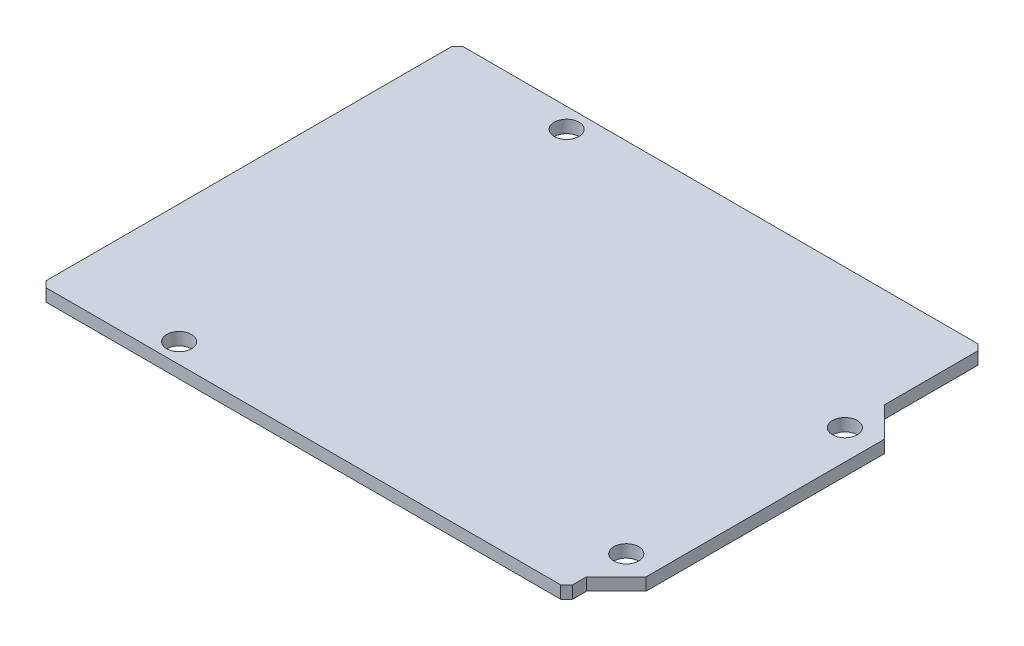
ISO-10303-21;
HEADER;
FILE_DESCRIPTION(('STEP AP214'),'2;1');
FILE_NAME('part.step','',(''),(''),'','','');
FILE_SCHEMA(('AUTOMOTIVE_DESIGN { 1 0 10303 214 1 1 1 1 }'));
ENDSEC;
DATA;
#1=APPLICATION_CONTEXT('core data for automotive mechanical design processes');
#2=APPLICATION_PROTOCOL_DEFINITION('international standard','automotive_design',2000,#1);
#3=PRODUCT_CONTEXT('',#1,'mechanical');
#4=PRODUCT('Part','Part','',(#3));
#5=PRODUCT_RELATED_PRODUCT_CATEGORY('part','',(#4));
#6=PRODUCT_DEFINITION_FORMATION('','',#4);
#7=PRODUCT_DEFINITION_CONTEXT('part definition',#1,'design');
#8=PRODUCT_DEFINITION('design','',#6,#7);
#9=PRODUCT_DEFINITION_SHAPE('','',#8);
#10=(LENGTH_UNIT() NAMED_UNIT(*) SI_UNIT(.MILLI.,.METRE.));
#11=(NAMED_UNIT(*) PLANE_ANGLE_UNIT() SI_UNIT($,.RADIAN.));
#12=(NAMED_UNIT(*) SI_UNIT($,.STERADIAN.) SOLID_ANGLE_UNIT());
#13=UNCERTAINTY_MEASURE_WITH_UNIT(LENGTH_MEASURE(1.E-05),#10,'distance_accuracy_value','');
#14=(GEOMETRIC_REPRESENTATION_CONTEXT(3) GLOBAL_UNCERTAINTY_ASSIGNED_CONTEXT((#13)) GLOBAL_UNIT_ASSIGNED_CONTEXT((#10,
#11,#12)) REPRESENTATION_CONTEXT('',''));
#15=CARTESIAN_POINT('',(0.,0.,0.));
#16=DIRECTION('',(0.,0.,1.));
#17=DIRECTION('',(1.,0.,0.));
#18=AXIS2_PLACEMENT_3D('',#15,#16,#17);
#19=CARTESIAN_POINT('',(0.,1.6002,0.));
#20=DIRECTION('',(0.,-1.,0.));
#21=DIRECTION('',(0.,0.,-1.));
#22=AXIS2_PLACEMENT_3D('',#19,#20,#21);
#23=PLANE('',#22);
#24=DIRECTION('',(-1.,0.,0.));
#25=VECTOR('',#24,1.);
#26=CARTESIAN_POINT('',(0.,1.6002,-53.34));
#27=LINE('',#26,#25);
#28=CARTESIAN_POINT('',(66.548,1.6002,-53.34));
#29=VERTEX_POINT('',#28);
#30=CARTESIAN_POINT('',(0.762000000000026,1.6002,-53.34));
#31=VERTEX_POINT('',#30);
#32=EDGE_CURVE('E159',#29,#31,#27,.T.);
#33=ORIENTED_EDGE('',*,*,#32,.T.);
#34=DIRECTION('',(0.707106781186548,0.,-0.707106781186548));
#35=VECTOR('',#34,1.);
#36=CARTESIAN_POINT('',(0.,1.6002,-52.578));
#37=LINE('',#36,#35);
#38=CARTESIAN_POINT('',(0.,1.6002,-52.578));
#39=VERTEX_POINT('',#38);
#40=EDGE_CURVE('E212',#31,#39,#37,.F.);
#41=ORIENTED_EDGE('',*,*,#40,.T.);
#42=DIRECTION('',(0.,0.,1.));
#43=VECTOR('',#42,1.);
#44=CARTESIAN_POINT('',(0.,1.6002,0.));
#45=LINE('',#44,#43);
#46=CARTESIAN_POINT('',(0.,1.6002,-0.761999999999985));
#47=VERTEX_POINT('',#46);
#48=EDGE_CURVE('E161',#39,#47,#45,.T.);
#49=ORIENTED_EDGE('',*,*,#48,.T.);
#50=DIRECTION('',(-0.707106781186548,0.,-0.707106781186548));
#51=VECTOR('',#50,1.);
#52=CARTESIAN_POINT('',(0.761999999999985,1.6002,0.));
#53=LINE('',#52,#51);
#54=CARTESIAN_POINT('',(0.762000000000013,1.6002,0.));
#55=VERTEX_POINT('',#54);
#56=EDGE_CURVE('E210',#47,#55,#53,.F.);
#57=ORIENTED_EDGE('',*,*,#56,.T.);
#58=DIRECTION('',(1.,0.,0.));
#59=VECTOR('',#58,1.);
#60=CARTESIAN_POINT('',(67.31,1.6002,0.));
#61=LINE('',#60,#59);
#62=CARTESIAN_POINT('',(66.548,1.6002,0.));
#63=VERTEX_POINT('',#62);
#64=EDGE_CURVE('E135',#55,#63,#61,.T.);
#65=ORIENTED_EDGE('',*,*,#64,.T.);
#66=DIRECTION('',(-0.707106781186548,0.,0.707106781186548));
#67=VECTOR('',#66,1.);
#68=CARTESIAN_POINT('',(67.31,1.6002,-0.761999999999985));
#69=LINE('',#68,#67);
#70=CARTESIAN_POINT('',(67.31,1.6002,-0.761999999999985));
#71=VERTEX_POINT('',#70);
#72=EDGE_CURVE('E60',#63,#71,#69,.F.);
#73=ORIENTED_EDGE('',*,*,#72,.T.);
#74=DIRECTION('',(0.,0.,-1.));
#75=VECTOR('',#74,1.);
#76=CARTESIAN_POINT('',(67.31,1.6002,0.));
#77=LINE('',#76,#75);
#78=CARTESIAN_POINT('',(67.31,1.6002,-2.54));
#79=VERTEX_POINT('',#78);
#80=EDGE_CURVE('E126',#71,#79,#77,.T.);
#81=ORIENTED_EDGE('',*,*,#80,.T.);
#82=DIRECTION('',(0.707106781186543,0.,-0.707106781186552));
#83=VECTOR('',#82,1.);
#84=CARTESIAN_POINT('',(67.31,1.6002,-2.54));
#85=LINE('',#84,#83);
#86=CARTESIAN_POINT('',(71.12,1.6002,-6.35000000000003));
#87=VERTEX_POINT('',#86);
#88=EDGE_CURVE('E131',#79,#87,#85,.T.);
#89=ORIENTED_EDGE('',*,*,#88,.T.);
#90=DIRECTION('',(0.,0.,-1.));
#91=VECTOR('',#90,1.);
#92=CARTESIAN_POINT('',(71.12,1.6002,-36.83));
#93=LINE('',#92,#91);
#94=CARTESIAN_POINT('',(71.12,1.6002,-36.83));
#95=VERTEX_POINT('',#94);
#96=EDGE_CURVE('E150',#87,#95,#93,.T.);
#97=ORIENTED_EDGE('',*,*,#96,.T.);
#98=DIRECTION('',(-0.707106781186549,0.,-0.707106781186546));
#99=VECTOR('',#98,1.);
#100=CARTESIAN_POINT('',(67.31,1.6002,-40.64));
#101=LINE('',#100,#99);
#102=CARTESIAN_POINT('',(67.31,1.6002,-40.64));
#103=VERTEX_POINT('',#102);
#104=EDGE_CURVE('E152',#95,#103,#101,.T.);
#105=ORIENTED_EDGE('',*,*,#104,.T.);
#106=DIRECTION('',(0.,0.,-1.));
#107=VECTOR('',#106,1.);
#108=CARTESIAN_POINT('',(67.31,1.6002,-53.34));
#109=LINE('',#108,#107);
#110=CARTESIAN_POINT('',(67.31,1.6002,-52.578));
#111=VERTEX_POINT('',#110);
#112=EDGE_CURVE('E157',#103,#111,#109,.T.);
#113=ORIENTED_EDGE('',*,*,#112,.T.);
#114=DIRECTION('',(0.707106781186554,0.,0.707106781186541));
#115=VECTOR('',#114,1.);
#116=CARTESIAN_POINT('',(66.548,1.6002,-53.34));
#117=LINE('',#116,#115);
#118=EDGE_CURVE('E208',#111,#29,#117,.F.);
#119=ORIENTED_EDGE('',*,*,#118,.T.);
#120=EDGE_LOOP('',(#33,#41,#49,#57,#65,#73,#81,#89,#97,#105,#113,#119));
#121=FACE_BOUND('',#120,.T.);
#122=CARTESIAN_POINT('',(16.51,1.6002,-50.8));
#123=DIRECTION('',(0.,1.,0.));
#124=DIRECTION('',(0.,0.,1.));
#125=AXIS2_PLACEMENT_3D('',#122,#123,#124);
#126=CIRCLE('',#125,1.5875);
#127=CARTESIAN_POINT('',(16.51,1.6002,-49.2125));
#128=VERTEX_POINT('',#127);
#129=EDGE_CURVE('E168',#128,#128,#126,.T.);
#130=ORIENTED_EDGE('',*,*,#129,.F.);
#131=EDGE_LOOP('',(#130));
#132=FACE_BOUND('',#131,.T.);
#133=CARTESIAN_POINT('',(15.24,1.6002,-2.53999999999999));
#134=DIRECTION('',(0.,1.,0.));
#135=DIRECTION('',(0.,0.,1.));
#136=AXIS2_PLACEMENT_3D('',#133,#134,#135);
#137=CIRCLE('',#136,1.5875);
#138=CARTESIAN_POINT('',(15.24,1.6002,-0.952499999999993));
#139=VERTEX_POINT('',#138);
#140=EDGE_CURVE('E235',#139,#139,#137,.T.);
#141=ORIENTED_EDGE('',*,*,#140,.F.);
#142=EDGE_LOOP('',(#141));
#143=FACE_BOUND('',#142,.T.);
#144=CARTESIAN_POINT('',(67.31,1.6002,-35.56));
#145=DIRECTION('',(0.,1.,0.));
#146=DIRECTION('',(0.,0.,1.));
#147=AXIS2_PLACEMENT_3D('',#144,#145,#146);
#148=CIRCLE('',#147,1.5875);
#149=CARTESIAN_POINT('',(67.31,1.6002,-33.9725));
#150=VERTEX_POINT('',#149);
#151=EDGE_CURVE('E241',#150,#150,#148,.T.);
#152=ORIENTED_EDGE('',*,*,#151,.F.);
#153=EDGE_LOOP('',(#152));
#154=FACE_BOUND('',#153,.T.);
#155=CARTESIAN_POINT('',(67.31,1.6002,-7.62));
#156=DIRECTION('',(0.,1.,0.));
#157=DIRECTION('',(0.,0.,1.));
#158=AXIS2_PLACEMENT_3D('',#155,#156,#157);
#159=CIRCLE('',#158,1.5875);
#160=CARTESIAN_POINT('',(67.31,1.6002,-6.0325));
#161=VERTEX_POINT('',#160);
#162=EDGE_CURVE('E247',#161,#161,#159,.T.);
#163=ORIENTED_EDGE('',*,*,#162,.F.);
#164=EDGE_LOOP('',(#163));
#165=FACE_BOUND('',#164,.T.);
#166=ADVANCED_FACE('F37',(#121,#132,#143,#154,#165),#23,.F.);
#167=CARTESIAN_POINT('',(0.,0.,0.));
#168=DIRECTION('',(0.,-1.,0.));
#169=DIRECTION('',(0.,0.,-1.));
#170=AXIS2_PLACEMENT_3D('',#167,#168,#169);
#171=PLANE('',#170);
#172=CARTESIAN_POINT('',(67.31,0.,-35.56));
#173=DIRECTION('',(0.,1.,0.));
#174=DIRECTION('',(0.,0.,1.));
#175=AXIS2_PLACEMENT_3D('',#172,#173,#174);
#176=CIRCLE('',#175,1.5875);
#177=CARTESIAN_POINT('',(67.31,0.,-33.9725));
#178=VERTEX_POINT('',#177);
#179=EDGE_CURVE('E244',#178,#178,#176,.T.);
#180=ORIENTED_EDGE('',*,*,#179,.T.);
#181=EDGE_LOOP('',(#180));
#182=FACE_BOUND('',#181,.T.);
#183=CARTESIAN_POINT('',(16.51,0.,-50.8));
#184=DIRECTION('',(0.,1.,0.));
#185=DIRECTION('',(0.,0.,1.));
#186=AXIS2_PLACEMENT_3D('',#183,#184,#185);
#187=CIRCLE('',#186,1.5875);
#188=CARTESIAN_POINT('',(16.51,0.,-49.2125));
#189=VERTEX_POINT('',#188);
#190=EDGE_CURVE('E232',#189,#189,#187,.T.);
#191=ORIENTED_EDGE('',*,*,#190,.T.);
#192=EDGE_LOOP('',(#191));
#193=FACE_BOUND('',#192,.T.);
#194=DIRECTION('',(0.,0.,1.));
#195=VECTOR('',#194,1.);
#196=CARTESIAN_POINT('',(0.,0.,0.));
#197=LINE('',#196,#195);
#198=CARTESIAN_POINT('',(0.,0.,-52.578));
#199=VERTEX_POINT('',#198);
#200=CARTESIAN_POINT('',(0.,0.,-0.761999999999985));
#201=VERTEX_POINT('',#200);
#202=EDGE_CURVE('E181',#199,#201,#197,.T.);
#203=ORIENTED_EDGE('',*,*,#202,.F.);
#204=DIRECTION('',(-0.707106781186548,0.,0.707106781186548));
#205=VECTOR('',#204,1.);
#206=CARTESIAN_POINT('',(-26.289,0.,-26.289));
#207=LINE('',#206,#205);
#208=CARTESIAN_POINT('',(0.762000000000026,0.,-53.34));
#209=VERTEX_POINT('',#208);
#210=EDGE_CURVE('E200',#199,#209,#207,.F.);
#211=ORIENTED_EDGE('',*,*,#210,.T.);
#212=DIRECTION('',(-1.,0.,0.));
#213=VECTOR('',#212,1.);
#214=CARTESIAN_POINT('',(0.,0.,-53.34));
#215=LINE('',#214,#213);
#216=CARTESIAN_POINT('',(66.548,0.,-53.34));
#217=VERTEX_POINT('',#216);
#218=EDGE_CURVE('E178',#217,#209,#215,.T.);
#219=ORIENTED_EDGE('',*,*,#218,.F.);
#220=DIRECTION('',(-0.707106781186554,0.,-0.707106781186541));
#221=VECTOR('',#220,1.);
#222=CARTESIAN_POINT('',(59.9439999999994,0.,-59.9440000000005));
#223=LINE('',#222,#221);
#224=CARTESIAN_POINT('',(67.31,0.,-52.578));
#225=VERTEX_POINT('',#224);
#226=EDGE_CURVE('E196',#217,#225,#223,.F.);
#227=ORIENTED_EDGE('',*,*,#226,.T.);
#228=DIRECTION('',(0.,0.,-1.));
#229=VECTOR('',#228,1.);
#230=CARTESIAN_POINT('',(67.31,0.,-53.34));
#231=LINE('',#230,#229);
#232=CARTESIAN_POINT('',(67.31,0.,-40.64));
#233=VERTEX_POINT('',#232);
#234=EDGE_CURVE('E176',#233,#225,#231,.T.);
#235=ORIENTED_EDGE('',*,*,#234,.F.);
#236=DIRECTION('',(-0.707106781186549,0.,-0.707106781186546));
#237=VECTOR('',#236,1.);
#238=CARTESIAN_POINT('',(67.31,0.,-40.64));
#239=LINE('',#238,#237);
#240=CARTESIAN_POINT('',(71.12,0.,-36.83));
#241=VERTEX_POINT('',#240);
#242=EDGE_CURVE('E174',#241,#233,#239,.T.);
#243=ORIENTED_EDGE('',*,*,#242,.F.);
#244=DIRECTION('',(0.,0.,-1.));
#245=VECTOR('',#244,1.);
#246=CARTESIAN_POINT('',(71.12,0.,-36.83));
#247=LINE('',#246,#245);
#248=CARTESIAN_POINT('',(71.12,0.,-6.35000000000003));
#249=VERTEX_POINT('',#248);
#250=EDGE_CURVE('E172',#249,#241,#247,.T.);
#251=ORIENTED_EDGE('',*,*,#250,.F.);
#252=DIRECTION('',(0.707106781186543,0.,-0.707106781186552));
#253=VECTOR('',#252,1.);
#254=CARTESIAN_POINT('',(67.31,0.,-2.54));
#255=LINE('',#254,#253);
#256=CARTESIAN_POINT('',(67.31,0.,-2.54));
#257=VERTEX_POINT('',#256);
#258=EDGE_CURVE('E170',#257,#249,#255,.T.);
#259=ORIENTED_EDGE('',*,*,#258,.F.);
#260=DIRECTION('',(0.,0.,-1.));
#261=VECTOR('',#260,1.);
#262=CARTESIAN_POINT('',(67.31,0.,0.));
#263=LINE('',#262,#261);
#264=CARTESIAN_POINT('',(67.31,0.,-0.761999999999985));
#265=VERTEX_POINT('',#264);
#266=EDGE_CURVE('E141',#265,#257,#263,.T.);
#267=ORIENTED_EDGE('',*,*,#266,.F.);
#268=DIRECTION('',(0.707106781186548,0.,-0.707106781186548));
#269=VECTOR('',#268,1.);
#270=CARTESIAN_POINT('',(33.274,0.,33.274));
#271=LINE('',#270,#269);
#272=CARTESIAN_POINT('',(66.548,0.,0.));
#273=VERTEX_POINT('',#272);
#274=EDGE_CURVE('E194',#265,#273,#271,.F.);
#275=ORIENTED_EDGE('',*,*,#274,.T.);
#276=DIRECTION('',(1.,0.,0.));
#277=VECTOR('',#276,1.);
#278=CARTESIAN_POINT('',(67.31,0.,0.));
#279=LINE('',#278,#277);
#280=CARTESIAN_POINT('',(0.762000000000013,0.,0.));
#281=VERTEX_POINT('',#280);
#282=EDGE_CURVE('E165',#281,#273,#279,.T.);
#283=ORIENTED_EDGE('',*,*,#282,.F.);
#284=DIRECTION('',(0.707106781186548,0.,0.707106781186548));
#285=VECTOR('',#284,1.);
#286=CARTESIAN_POINT('',(0.380999999999992,0.,-0.380999999999992));
#287=LINE('',#286,#285);
#288=EDGE_CURVE('E198',#281,#201,#287,.F.);
#289=ORIENTED_EDGE('',*,*,#288,.T.);
#290=EDGE_LOOP('',(#203,#211,#219,#227,#235,#243,#251,#259,#267,#275,#283,#289));
#291=FACE_BOUND('',#290,.T.);
#292=CARTESIAN_POINT('',(15.24,0.,-2.53999999999999));
#293=DIRECTION('',(0.,1.,0.));
#294=DIRECTION('',(0.,0.,1.));
#295=AXIS2_PLACEMENT_3D('',#292,#293,#294);
#296=CIRCLE('',#295,1.5875);
#297=CARTESIAN_POINT('',(15.24,0.,-0.952499999999993));
#298=VERTEX_POINT('',#297);
#299=EDGE_CURVE('E238',#298,#298,#296,.T.);
#300=ORIENTED_EDGE('',*,*,#299,.T.);
#301=EDGE_LOOP('',(#300));
#302=FACE_BOUND('',#301,.T.);
#303=CARTESIAN_POINT('',(67.31,0.,-7.62));
#304=DIRECTION('',(0.,1.,0.));
#305=DIRECTION('',(0.,0.,1.));
#306=AXIS2_PLACEMENT_3D('',#303,#304,#305);
#307=CIRCLE('',#306,1.5875);
#308=CARTESIAN_POINT('',(67.31,0.,-6.0325));
#309=VERTEX_POINT('',#308);
#310=EDGE_CURVE('E250',#309,#309,#307,.T.);
#311=ORIENTED_EDGE('',*,*,#310,.T.);
#312=EDGE_LOOP('',(#311));
#313=FACE_BOUND('',#312,.T.);
#314=ADVANCED_FACE('F228',(#182,#193,#291,#302,#313),#171,.T.);
#315=CARTESIAN_POINT('',(67.31,1.6002,0.));
#316=DIRECTION('',(0.,0.,-1.));
#317=DIRECTION('',(-1.,0.,0.));
#318=AXIS2_PLACEMENT_3D('',#315,#316,#317);
#319=PLANE('',#318);
#320=ORIENTED_EDGE('',*,*,#64,.F.);
#321=DIRECTION('',(0.,-1.,0.));
#322=VECTOR('',#321,1.);
#323=CARTESIAN_POINT('',(0.761999999999985,1.6002,0.));
#324=LINE('',#323,#322);
#325=EDGE_CURVE('E216',#55,#281,#324,.T.);
#326=ORIENTED_EDGE('',*,*,#325,.T.);
#327=ORIENTED_EDGE('',*,*,#282,.T.);
#328=DIRECTION('',(0.,1.,0.));
#329=VECTOR('',#328,1.);
#330=CARTESIAN_POINT('',(66.548,1.6002,0.));
#331=LINE('',#330,#329);
#332=EDGE_CURVE('E214',#273,#63,#331,.T.);
#333=ORIENTED_EDGE('',*,*,#332,.T.);
#334=EDGE_LOOP('',(#320,#326,#327,#333));
#335=FACE_BOUND('',#334,.T.);
#336=ADVANCED_FACE('F222',(#335),#319,.F.);
#337=CARTESIAN_POINT('',(67.31,1.6002,0.));
#338=DIRECTION('',(-1.,0.,0.));
#339=DIRECTION('',(0.,0.,1.));
#340=AXIS2_PLACEMENT_3D('',#337,#338,#339);
#341=PLANE('',#340);
#342=ORIENTED_EDGE('',*,*,#80,.F.);
#343=DIRECTION('',(0.,-1.,0.));
#344=VECTOR('',#343,1.);
#345=CARTESIAN_POINT('',(67.31,1.6002,-0.761999999999985));
#346=LINE('',#345,#344);
#347=EDGE_CURVE('E11',#71,#265,#346,.T.);
#348=ORIENTED_EDGE('',*,*,#347,.T.);
#349=ORIENTED_EDGE('',*,*,#266,.T.);
#350=DIRECTION('',(0.,-1.,0.));
#351=VECTOR('',#350,1.);
#352=CARTESIAN_POINT('',(67.31,1.6002,-2.54));
#353=LINE('',#352,#351);
#354=EDGE_CURVE('E138',#79,#257,#353,.T.);
#355=ORIENTED_EDGE('',*,*,#354,.F.);
#356=EDGE_LOOP('',(#342,#348,#349,#355));
#357=FACE_BOUND('',#356,.T.);
#358=ADVANCED_FACE('F139',(#357),#341,.F.);
#359=CARTESIAN_POINT('',(67.31,1.6002,-2.54));
#360=DIRECTION('',(-0.707106781186552,0.,-0.707106781186543));
#361=DIRECTION('',(-0.707106781186543,0.,0.707106781186552));
#362=AXIS2_PLACEMENT_3D('',#359,#360,#361);
#363=PLANE('',#362);
#364=ORIENTED_EDGE('',*,*,#258,.T.);
#365=DIRECTION('',(0.,-1.,0.));
#366=VECTOR('',#365,1.);
#367=CARTESIAN_POINT('',(71.12,1.6002,-6.35000000000003));
#368=LINE('',#367,#366);
#369=EDGE_CURVE('E145',#87,#249,#368,.T.);
#370=ORIENTED_EDGE('',*,*,#369,.F.);
#371=ORIENTED_EDGE('',*,*,#88,.F.);
#372=ORIENTED_EDGE('',*,*,#354,.T.);
#373=EDGE_LOOP('',(#364,#370,#371,#372));
#374=FACE_BOUND('',#373,.T.);
#375=ADVANCED_FACE('F147',(#374),#363,.F.);
#376=CARTESIAN_POINT('',(71.12,1.6002,-36.83));
#377=DIRECTION('',(-1.,0.,0.));
#378=DIRECTION('',(0.,0.,1.));
#379=AXIS2_PLACEMENT_3D('',#376,#377,#378);
#380=PLANE('',#379);
#381=ORIENTED_EDGE('',*,*,#250,.T.);
#382=DIRECTION('',(0.,-1.,0.));
#383=VECTOR('',#382,1.);
#384=CARTESIAN_POINT('',(71.12,1.6002,-36.83));
#385=LINE('',#384,#383);
#386=EDGE_CURVE('E186',#95,#241,#385,.T.);
#387=ORIENTED_EDGE('',*,*,#386,.F.);
#388=ORIENTED_EDGE('',*,*,#96,.F.);
#389=ORIENTED_EDGE('',*,*,#369,.T.);
#390=EDGE_LOOP('',(#381,#387,#388,#389));
#391=FACE_BOUND('',#390,.T.);
#392=ADVANCED_FACE('F284',(#391),#380,.F.);
#393=CARTESIAN_POINT('',(67.31,1.6002,-40.64));
#394=DIRECTION('',(-0.707106781186546,0.,0.707106781186549));
#395=DIRECTION('',(0.707106781186549,0.,0.707106781186546));
#396=AXIS2_PLACEMENT_3D('',#393,#394,#395);
#397=PLANE('',#396);
#398=ORIENTED_EDGE('',*,*,#242,.T.);
#399=DIRECTION('',(0.,-1.,0.));
#400=VECTOR('',#399,1.);
#401=CARTESIAN_POINT('',(67.31,1.6002,-40.64));
#402=LINE('',#401,#400);
#403=EDGE_CURVE('E164',#103,#233,#402,.T.);
#404=ORIENTED_EDGE('',*,*,#403,.F.);
#405=ORIENTED_EDGE('',*,*,#104,.F.);
#406=ORIENTED_EDGE('',*,*,#386,.T.);
#407=EDGE_LOOP('',(#398,#404,#405,#406));
#408=FACE_BOUND('',#407,.T.);
#409=ADVANCED_FACE('F281',(#408),#397,.F.);
#410=CARTESIAN_POINT('',(67.31,1.6002,-53.34));
#411=DIRECTION('',(-1.,0.,0.));
#412=DIRECTION('',(0.,0.,1.));
#413=AXIS2_PLACEMENT_3D('',#410,#411,#412);
#414=PLANE('',#413);
#415=ORIENTED_EDGE('',*,*,#234,.T.);
#416=DIRECTION('',(0.,1.,0.));
#417=VECTOR('',#416,1.);
#418=CARTESIAN_POINT('',(67.31,1.6002,-52.578));
#419=LINE('',#418,#417);
#420=EDGE_CURVE('E46',#225,#111,#419,.T.);
#421=ORIENTED_EDGE('',*,*,#420,.T.);
#422=ORIENTED_EDGE('',*,*,#112,.F.);
#423=ORIENTED_EDGE('',*,*,#403,.T.);
#424=EDGE_LOOP('',(#415,#421,#422,#423));
#425=FACE_BOUND('',#424,.T.);
#426=ADVANCED_FACE('F277',(#425),#414,.F.);
#427=CARTESIAN_POINT('',(0.,1.6002,-53.34));
#428=DIRECTION('',(0.,0.,1.));
#429=DIRECTION('',(1.,0.,0.));
#430=AXIS2_PLACEMENT_3D('',#427,#428,#429);
#431=PLANE('',#430);
#432=ORIENTED_EDGE('',*,*,#218,.T.);
#433=DIRECTION('',(0.,1.,0.));
#434=VECTOR('',#433,1.);
#435=CARTESIAN_POINT('',(0.762000000000026,1.6002,-53.34));
#436=LINE('',#435,#434);
#437=EDGE_CURVE('E205',#209,#31,#436,.T.);
#438=ORIENTED_EDGE('',*,*,#437,.T.);
#439=ORIENTED_EDGE('',*,*,#32,.F.);
#440=DIRECTION('',(0.,-1.,0.));
#441=VECTOR('',#440,1.);
#442=CARTESIAN_POINT('',(66.548,1.6002,-53.34));
#443=LINE('',#442,#441);
#444=EDGE_CURVE('E202',#29,#217,#443,.T.);
#445=ORIENTED_EDGE('',*,*,#444,.T.);
#446=EDGE_LOOP('',(#432,#438,#439,#445));
#447=FACE_BOUND('',#446,.T.);
#448=ADVANCED_FACE('F273',(#447),#431,.F.);
#449=CARTESIAN_POINT('',(0.,1.6002,0.));
#450=DIRECTION('',(1.,0.,0.));
#451=DIRECTION('',(0.,0.,-1.));
#452=AXIS2_PLACEMENT_3D('',#449,#450,#451);
#453=PLANE('',#452);
#454=ORIENTED_EDGE('',*,*,#48,.F.);
#455=DIRECTION('',(0.,-1.,0.));
#456=VECTOR('',#455,1.);
#457=CARTESIAN_POINT('',(0.,1.6002,-52.578));
#458=LINE('',#457,#456);
#459=EDGE_CURVE('E191',#39,#199,#458,.T.);
#460=ORIENTED_EDGE('',*,*,#459,.T.);
#461=ORIENTED_EDGE('',*,*,#202,.T.);
#462=DIRECTION('',(0.,1.,0.));
#463=VECTOR('',#462,1.);
#464=CARTESIAN_POINT('',(0.,1.6002,-0.761999999999985));
#465=LINE('',#464,#463);
#466=EDGE_CURVE('E144',#201,#47,#465,.T.);
#467=ORIENTED_EDGE('',*,*,#466,.T.);
#468=EDGE_LOOP('',(#454,#460,#461,#467));
#469=FACE_BOUND('',#468,.T.);
#470=ADVANCED_FACE('F270',(#469),#453,.F.);
#471=CARTESIAN_POINT('',(16.51,1.6002,-50.8));
#472=DIRECTION('',(0.,-1.,0.));
#473=DIRECTION('',(0.,0.,-1.));
#474=AXIS2_PLACEMENT_3D('',#471,#472,#473);
#475=CYLINDRICAL_SURFACE('',#474,1.5875);
#476=ORIENTED_EDGE('',*,*,#129,.T.);
#477=EDGE_LOOP('',(#476));
#478=FACE_BOUND('',#477,.T.);
#479=ORIENTED_EDGE('',*,*,#190,.F.);
#480=EDGE_LOOP('',(#479));
#481=FACE_BOUND('',#480,.T.);
#482=ADVANCED_FACE('F267',(#478,#481),#475,.F.);
#483=CARTESIAN_POINT('',(15.24,1.6002,-2.53999999999999));
#484=DIRECTION('',(0.,-1.,0.));
#485=DIRECTION('',(0.,0.,-1.));
#486=AXIS2_PLACEMENT_3D('',#483,#484,#485);
#487=CYLINDRICAL_SURFACE('',#486,1.5875);
#488=ORIENTED_EDGE('',*,*,#140,.T.);
#489=EDGE_LOOP('',(#488));
#490=FACE_BOUND('',#489,.T.);
#491=ORIENTED_EDGE('',*,*,#299,.F.);
#492=EDGE_LOOP('',(#491));
#493=FACE_BOUND('',#492,.T.);
#494=ADVANCED_FACE('F412',(#490,#493),#487,.F.);
#495=CARTESIAN_POINT('',(67.31,1.6002,-35.56));
#496=DIRECTION('',(0.,-1.,0.));
#497=DIRECTION('',(0.,0.,-1.));
#498=AXIS2_PLACEMENT_3D('',#495,#496,#497);
#499=CYLINDRICAL_SURFACE('',#498,1.5875);
#500=ORIENTED_EDGE('',*,*,#151,.T.);
#501=EDGE_LOOP('',(#500));
#502=FACE_BOUND('',#501,.T.);
#503=ORIENTED_EDGE('',*,*,#179,.F.);
#504=EDGE_LOOP('',(#503));
#505=FACE_BOUND('',#504,.T.);
#506=ADVANCED_FACE('F403',(#502,#505),#499,.F.);
#507=CARTESIAN_POINT('',(67.31,1.6002,-7.62));
#508=DIRECTION('',(0.,-1.,0.));
#509=DIRECTION('',(0.,0.,-1.));
#510=AXIS2_PLACEMENT_3D('',#507,#508,#509);
#511=CYLINDRICAL_SURFACE('',#510,1.5875);
#512=ORIENTED_EDGE('',*,*,#162,.T.);
#513=EDGE_LOOP('',(#512));
#514=FACE_BOUND('',#513,.T.);
#515=ORIENTED_EDGE('',*,*,#310,.F.);
#516=EDGE_LOOP('',(#515));
#517=FACE_BOUND('',#516,.T.);
#518=ADVANCED_FACE('F256',(#514,#517),#511,.F.);
#519=CARTESIAN_POINT('',(0.,1.6002,-52.578));
#520=DIRECTION('',(0.707106781186548,0.,0.707106781186548));
#521=DIRECTION('',(0.,-1.,0.));
#522=AXIS2_PLACEMENT_3D('',#519,#520,#521);
#523=PLANE('',#522);
#524=ORIENTED_EDGE('',*,*,#40,.F.);
#525=ORIENTED_EDGE('',*,*,#437,.F.);
#526=ORIENTED_EDGE('',*,*,#210,.F.);
#527=ORIENTED_EDGE('',*,*,#459,.F.);
#528=EDGE_LOOP('',(#524,#525,#526,#527));
#529=FACE_BOUND('',#528,.T.);
#530=ADVANCED_FACE('F296',(#529),#523,.F.);
#531=CARTESIAN_POINT('',(0.761999999999985,1.6002,0.));
#532=DIRECTION('',(0.707106781186548,0.,-0.707106781186548));
#533=DIRECTION('',(0.,-1.,0.));
#534=AXIS2_PLACEMENT_3D('',#531,#532,#533);
#535=PLANE('',#534);
#536=ORIENTED_EDGE('',*,*,#56,.F.);
#537=ORIENTED_EDGE('',*,*,#466,.F.);
#538=ORIENTED_EDGE('',*,*,#288,.F.);
#539=ORIENTED_EDGE('',*,*,#325,.F.);
#540=EDGE_LOOP('',(#536,#537,#538,#539));
#541=FACE_BOUND('',#540,.T.);
#542=ADVANCED_FACE('F302',(#541),#535,.F.);
#543=CARTESIAN_POINT('',(66.548,1.6002,-53.34));
#544=DIRECTION('',(-0.707106781186541,0.,0.707106781186554));
#545=DIRECTION('',(0.,-1.,0.));
#546=AXIS2_PLACEMENT_3D('',#543,#544,#545);
#547=PLANE('',#546);
#548=ORIENTED_EDGE('',*,*,#118,.F.);
#549=ORIENTED_EDGE('',*,*,#420,.F.);
#550=ORIENTED_EDGE('',*,*,#226,.F.);
#551=ORIENTED_EDGE('',*,*,#444,.F.);
#552=EDGE_LOOP('',(#548,#549,#550,#551));
#553=FACE_BOUND('',#552,.T.);
#554=ADVANCED_FACE('F308',(#553),#547,.F.);
#555=CARTESIAN_POINT('',(67.31,1.6002,-0.761999999999985));
#556=DIRECTION('',(-0.707106781186548,0.,-0.707106781186548));
#557=DIRECTION('',(0.,-1.,0.));
#558=AXIS2_PLACEMENT_3D('',#555,#556,#557);
#559=PLANE('',#558);
#560=ORIENTED_EDGE('',*,*,#72,.F.);
#561=ORIENTED_EDGE('',*,*,#332,.F.);
#562=ORIENTED_EDGE('',*,*,#274,.F.);
#563=ORIENTED_EDGE('',*,*,#347,.F.);
#564=EDGE_LOOP('',(#560,#561,#562,#563));
#565=FACE_BOUND('',#564,.T.);
#566=ADVANCED_FACE('F40',(#565),#559,.F.);
#567=CLOSED_SHELL('',(#166,#314,#336,#358,#375,#392,#409,#426,#448,#470,#482,#494,#506,#518,
#530,#542,#554,#566));
#568=MANIFOLD_SOLID_BREP('B2',#567);
#569=ADVANCED_BREP_SHAPE_REPRESENTATION('',(#18,#568),#14);
#570=SHAPE_DEFINITION_REPRESENTATION(#9,#569);
ENDSEC;
END-ISO-10303-21;
